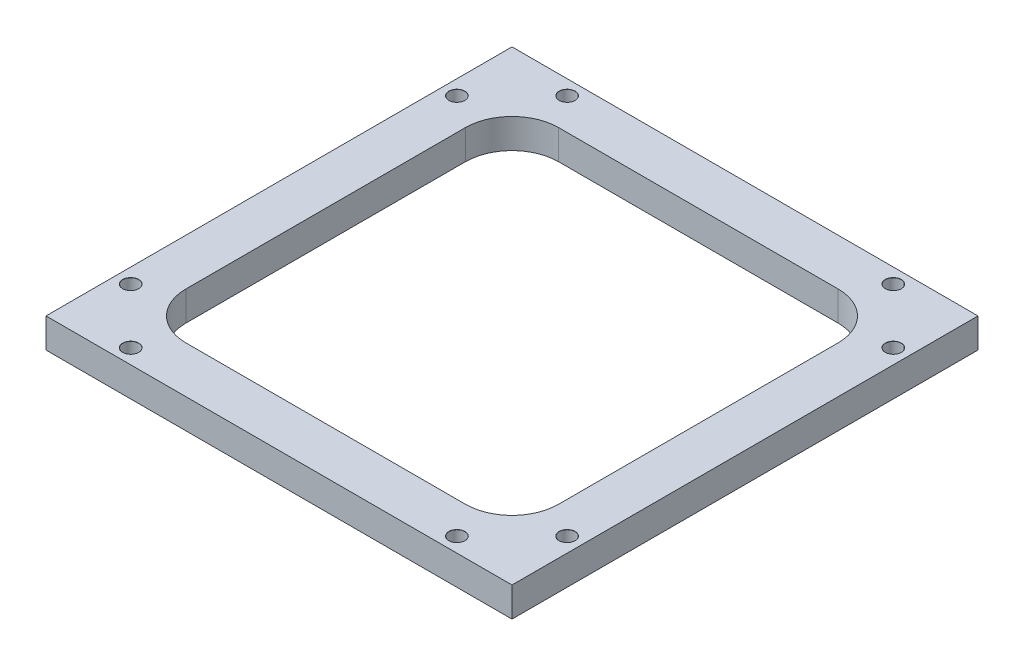
ISO-10303-21;
HEADER;
FILE_DESCRIPTION(('STEP AP214'),'2;1');
FILE_NAME('part.step','',(''),(''),'','','');
FILE_SCHEMA(('AUTOMOTIVE_DESIGN { 1 0 10303 214 1 1 1 1 }'));
ENDSEC;
DATA;
#1=APPLICATION_CONTEXT('core data for automotive mechanical design processes');
#2=APPLICATION_PROTOCOL_DEFINITION('international standard','automotive_design',2000,#1);
#3=PRODUCT_CONTEXT('',#1,'mechanical');
#4=PRODUCT('Part','Part','',(#3));
#5=PRODUCT_RELATED_PRODUCT_CATEGORY('part','',(#4));
#6=PRODUCT_DEFINITION_FORMATION('','',#4);
#7=PRODUCT_DEFINITION_CONTEXT('part definition',#1,'design');
#8=PRODUCT_DEFINITION('design','',#6,#7);
#9=PRODUCT_DEFINITION_SHAPE('','',#8);
#10=(LENGTH_UNIT() NAMED_UNIT(*) SI_UNIT(.MILLI.,.METRE.));
#11=(NAMED_UNIT(*) PLANE_ANGLE_UNIT() SI_UNIT($,.RADIAN.));
#12=(NAMED_UNIT(*) SI_UNIT($,.STERADIAN.) SOLID_ANGLE_UNIT());
#13=UNCERTAINTY_MEASURE_WITH_UNIT(LENGTH_MEASURE(1.E-05),#10,'distance_accuracy_value','');
#14=(GEOMETRIC_REPRESENTATION_CONTEXT(3) GLOBAL_UNCERTAINTY_ASSIGNED_CONTEXT((#13)) GLOBAL_UNIT_ASSIGNED_CONTEXT((#10,
#11,#12)) REPRESENTATION_CONTEXT('',''));
#15=CARTESIAN_POINT('',(0.,0.,0.));
#16=DIRECTION('',(0.,0.,1.));
#17=DIRECTION('',(1.,0.,0.));
#18=AXIS2_PLACEMENT_3D('',#15,#16,#17);
#19=CARTESIAN_POINT('',(0.,6.35,50.));
#20=DIRECTION('',(0.,0.,-1.));
#21=DIRECTION('',(-1.,0.,0.));
#22=AXIS2_PLACEMENT_3D('',#19,#20,#21);
#23=PLANE('',#22);
#24=DIRECTION('',(1.,0.,0.));
#25=VECTOR('',#24,1.);
#26=CARTESIAN_POINT('',(0.,0.,50.));
#27=LINE('',#26,#25);
#28=CARTESIAN_POINT('',(-50.,0.,50.));
#29=VERTEX_POINT('',#28);
#30=CARTESIAN_POINT('',(50.,0.,50.));
#31=VERTEX_POINT('',#30);
#32=EDGE_CURVE('E249',#29,#31,#27,.T.);
#33=ORIENTED_EDGE('',*,*,#32,.T.);
#34=DIRECTION('',(0.,-1.,0.));
#35=VECTOR('',#34,1.);
#36=CARTESIAN_POINT('',(50.,6.35,50.));
#37=LINE('',#36,#35);
#38=CARTESIAN_POINT('',(50.,6.35,50.));
#39=VERTEX_POINT('',#38);
#40=EDGE_CURVE('E278',#39,#31,#37,.T.);
#41=ORIENTED_EDGE('',*,*,#40,.F.);
#42=DIRECTION('',(1.,0.,0.));
#43=VECTOR('',#42,1.);
#44=CARTESIAN_POINT('',(0.,6.35,50.));
#45=LINE('',#44,#43);
#46=CARTESIAN_POINT('',(-50.,6.35,50.));
#47=VERTEX_POINT('',#46);
#48=EDGE_CURVE('E250',#47,#39,#45,.T.);
#49=ORIENTED_EDGE('',*,*,#48,.F.);
#50=DIRECTION('',(0.,-1.,0.));
#51=VECTOR('',#50,1.);
#52=CARTESIAN_POINT('',(-50.,6.35,50.));
#53=LINE('',#52,#51);
#54=EDGE_CURVE('E262',#47,#29,#53,.T.);
#55=ORIENTED_EDGE('',*,*,#54,.T.);
#56=EDGE_LOOP('',(#33,#41,#49,#55));
#57=FACE_BOUND('',#56,.T.);
#58=ADVANCED_FACE('F40',(#57),#23,.F.);
#59=CARTESIAN_POINT('',(50.,6.35,0.));
#60=DIRECTION('',(-1.,0.,0.));
#61=DIRECTION('',(0.,0.,1.));
#62=AXIS2_PLACEMENT_3D('',#59,#60,#61);
#63=PLANE('',#62);
#64=DIRECTION('',(0.,0.,-1.));
#65=VECTOR('',#64,1.);
#66=CARTESIAN_POINT('',(50.,0.,0.));
#67=LINE('',#66,#65);
#68=CARTESIAN_POINT('',(50.,0.,-50.));
#69=VERTEX_POINT('',#68);
#70=EDGE_CURVE('E265',#31,#69,#67,.T.);
#71=ORIENTED_EDGE('',*,*,#70,.T.);
#72=DIRECTION('',(0.,-1.,0.));
#73=VECTOR('',#72,1.);
#74=CARTESIAN_POINT('',(50.,6.35,-50.));
#75=LINE('',#74,#73);
#76=CARTESIAN_POINT('',(50.,6.35,-50.));
#77=VERTEX_POINT('',#76);
#78=EDGE_CURVE('E276',#77,#69,#75,.T.);
#79=ORIENTED_EDGE('',*,*,#78,.F.);
#80=DIRECTION('',(0.,0.,-1.));
#81=VECTOR('',#80,1.);
#82=CARTESIAN_POINT('',(50.,6.35,0.));
#83=LINE('',#82,#81);
#84=EDGE_CURVE('E253',#39,#77,#83,.T.);
#85=ORIENTED_EDGE('',*,*,#84,.F.);
#86=ORIENTED_EDGE('',*,*,#40,.T.);
#87=EDGE_LOOP('',(#71,#79,#85,#86));
#88=FACE_BOUND('',#87,.T.);
#89=ADVANCED_FACE('F331',(#88),#63,.F.);
#90=CARTESIAN_POINT('',(0.,6.35,-50.));
#91=DIRECTION('',(0.,0.,-1.));
#92=DIRECTION('',(-1.,0.,0.));
#93=AXIS2_PLACEMENT_3D('',#90,#91,#92);
#94=PLANE('',#93);
#95=DIRECTION('',(1.,0.,0.));
#96=VECTOR('',#95,1.);
#97=CARTESIAN_POINT('',(0.,0.,-50.));
#98=LINE('',#97,#96);
#99=CARTESIAN_POINT('',(-50.,0.,-50.));
#100=VERTEX_POINT('',#99);
#101=EDGE_CURVE('E268',#100,#69,#98,.T.);
#102=ORIENTED_EDGE('',*,*,#101,.F.);
#103=DIRECTION('',(0.,-1.,0.));
#104=VECTOR('',#103,1.);
#105=CARTESIAN_POINT('',(-50.,6.35,-50.));
#106=LINE('',#105,#104);
#107=CARTESIAN_POINT('',(-50.,6.35,-50.));
#108=VERTEX_POINT('',#107);
#109=EDGE_CURVE('E274',#108,#100,#106,.T.);
#110=ORIENTED_EDGE('',*,*,#109,.F.);
#111=DIRECTION('',(1.,0.,0.));
#112=VECTOR('',#111,1.);
#113=CARTESIAN_POINT('',(0.,6.35,-50.));
#114=LINE('',#113,#112);
#115=EDGE_CURVE('E256',#108,#77,#114,.T.);
#116=ORIENTED_EDGE('',*,*,#115,.T.);
#117=ORIENTED_EDGE('',*,*,#78,.T.);
#118=EDGE_LOOP('',(#102,#110,#116,#117));
#119=FACE_BOUND('',#118,.T.);
#120=ADVANCED_FACE('F336',(#119),#94,.T.);
#121=CARTESIAN_POINT('',(-50.,6.35,0.));
#122=DIRECTION('',(-1.,0.,0.));
#123=DIRECTION('',(0.,0.,1.));
#124=AXIS2_PLACEMENT_3D('',#121,#122,#123);
#125=PLANE('',#124);
#126=DIRECTION('',(0.,0.,-1.));
#127=VECTOR('',#126,1.);
#128=CARTESIAN_POINT('',(-50.,0.,0.));
#129=LINE('',#128,#127);
#130=EDGE_CURVE('E254',#29,#100,#129,.T.);
#131=ORIENTED_EDGE('',*,*,#130,.F.);
#132=ORIENTED_EDGE('',*,*,#54,.F.);
#133=DIRECTION('',(0.,0.,-1.));
#134=VECTOR('',#133,1.);
#135=CARTESIAN_POINT('',(-50.,6.35,0.));
#136=LINE('',#135,#134);
#137=EDGE_CURVE('E259',#47,#108,#136,.T.);
#138=ORIENTED_EDGE('',*,*,#137,.T.);
#139=ORIENTED_EDGE('',*,*,#109,.T.);
#140=EDGE_LOOP('',(#131,#132,#138,#139));
#141=FACE_BOUND('',#140,.T.);
#142=ADVANCED_FACE('F344',(#141),#125,.T.);
#143=CARTESIAN_POINT('',(0.,6.35,0.));
#144=DIRECTION('',(0.,1.,0.));
#145=DIRECTION('',(0.,0.,1.));
#146=AXIS2_PLACEMENT_3D('',#143,#144,#145);
#147=PLANE('',#146);
#148=CARTESIAN_POINT('',(-30.,6.35,30.));
#149=DIRECTION('',(0.,1.,0.));
#150=DIRECTION('',(0.,0.,-1.));
#151=AXIS2_PLACEMENT_3D('',#148,#149,#150);
#152=CIRCLE('',#151,10.);
#153=CARTESIAN_POINT('',(-40.,6.35,29.9999999999999));
#154=VERTEX_POINT('',#153);
#155=CARTESIAN_POINT('',(-29.9999999999999,6.35,40.));
#156=VERTEX_POINT('',#155);
#157=EDGE_CURVE('E54',#154,#156,#152,.T.);
#158=ORIENTED_EDGE('',*,*,#157,.F.);
#159=DIRECTION('',(0.,0.,1.));
#160=VECTOR('',#159,1.);
#161=CARTESIAN_POINT('',(-40.,6.35,29.9999999999999));
#162=LINE('',#161,#160);
#163=CARTESIAN_POINT('',(-40.,6.35,-29.9999999999999));
#164=VERTEX_POINT('',#163);
#165=EDGE_CURVE('E162',#164,#154,#162,.T.);
#166=ORIENTED_EDGE('',*,*,#165,.F.);
#167=CARTESIAN_POINT('',(-30.,6.35,-30.));
#168=DIRECTION('',(0.,1.,0.));
#169=DIRECTION('',(0.,0.,1.));
#170=AXIS2_PLACEMENT_3D('',#167,#168,#169);
#171=CIRCLE('',#170,10.);
#172=CARTESIAN_POINT('',(-29.9999999999999,6.35,-40.));
#173=VERTEX_POINT('',#172);
#174=EDGE_CURVE('E159',#173,#164,#171,.T.);
#175=ORIENTED_EDGE('',*,*,#174,.F.);
#176=DIRECTION('',(-1.,0.,0.));
#177=VECTOR('',#176,1.);
#178=CARTESIAN_POINT('',(-29.9999999999999,6.35,-40.));
#179=LINE('',#178,#177);
#180=CARTESIAN_POINT('',(29.9999999999999,6.35,-40.));
#181=VERTEX_POINT('',#180);
#182=EDGE_CURVE('E156',#181,#173,#179,.T.);
#183=ORIENTED_EDGE('',*,*,#182,.F.);
#184=CARTESIAN_POINT('',(30.,6.35,-30.));
#185=DIRECTION('',(0.,1.,0.));
#186=DIRECTION('',(0.,0.,-1.));
#187=AXIS2_PLACEMENT_3D('',#184,#185,#186);
#188=CIRCLE('',#187,10.);
#189=CARTESIAN_POINT('',(40.,6.35,-29.9999999999999));
#190=VERTEX_POINT('',#189);
#191=EDGE_CURVE('E150',#190,#181,#188,.T.);
#192=ORIENTED_EDGE('',*,*,#191,.F.);
#193=DIRECTION('',(0.,0.,-1.));
#194=VECTOR('',#193,1.);
#195=CARTESIAN_POINT('',(40.,6.35,29.9999999999999));
#196=LINE('',#195,#194);
#197=CARTESIAN_POINT('',(40.,6.35,29.9999999999999));
#198=VERTEX_POINT('',#197);
#199=EDGE_CURVE('E148',#198,#190,#196,.T.);
#200=ORIENTED_EDGE('',*,*,#199,.F.);
#201=CARTESIAN_POINT('',(30.,6.35,30.));
#202=DIRECTION('',(0.,1.,0.));
#203=DIRECTION('',(0.,0.,-1.));
#204=AXIS2_PLACEMENT_3D('',#201,#202,#203);
#205=CIRCLE('',#204,10.);
#206=CARTESIAN_POINT('',(29.9999999999999,6.35,40.));
#207=VERTEX_POINT('',#206);
#208=EDGE_CURVE('E131',#207,#198,#205,.T.);
#209=ORIENTED_EDGE('',*,*,#208,.F.);
#210=DIRECTION('',(1.,0.,0.));
#211=VECTOR('',#210,1.);
#212=CARTESIAN_POINT('',(-29.9999999999999,6.35,40.));
#213=LINE('',#212,#211);
#214=EDGE_CURVE('E140',#156,#207,#213,.T.);
#215=ORIENTED_EDGE('',*,*,#214,.F.);
#216=EDGE_LOOP('',(#158,#166,#175,#183,#192,#200,#209,#215));
#217=FACE_BOUND('',#216,.T.);
#218=CARTESIAN_POINT('',(-46.825,6.35,-35.));
#219=DIRECTION('',(0.,1.,0.));
#220=DIRECTION('',(0.,0.,1.));
#221=AXIS2_PLACEMENT_3D('',#218,#219,#220);
#222=CIRCLE('',#221,1.725);
#223=CARTESIAN_POINT('',(-46.825,6.35,-33.275));
#224=VERTEX_POINT('',#223);
#225=EDGE_CURVE('E167',#224,#224,#222,.T.);
#226=ORIENTED_EDGE('',*,*,#225,.F.);
#227=EDGE_LOOP('',(#226));
#228=FACE_BOUND('',#227,.T.);
#229=CARTESIAN_POINT('',(-35.,6.35,-46.825));
#230=DIRECTION('',(0.,1.,0.));
#231=DIRECTION('',(0.,0.,1.));
#232=AXIS2_PLACEMENT_3D('',#229,#230,#231);
#233=CIRCLE('',#232,1.725);
#234=CARTESIAN_POINT('',(-35.,6.35,-45.1));
#235=VERTEX_POINT('',#234);
#236=EDGE_CURVE('E186',#235,#235,#233,.T.);
#237=ORIENTED_EDGE('',*,*,#236,.F.);
#238=EDGE_LOOP('',(#237));
#239=FACE_BOUND('',#238,.T.);
#240=CARTESIAN_POINT('',(35.,6.35,-46.825));
#241=DIRECTION('',(0.,1.,0.));
#242=DIRECTION('',(0.,0.,1.));
#243=AXIS2_PLACEMENT_3D('',#240,#241,#242);
#244=CIRCLE('',#243,1.725);
#245=CARTESIAN_POINT('',(35.,6.35,-45.1));
#246=VERTEX_POINT('',#245);
#247=EDGE_CURVE('E195',#246,#246,#244,.T.);
#248=ORIENTED_EDGE('',*,*,#247,.F.);
#249=EDGE_LOOP('',(#248));
#250=FACE_BOUND('',#249,.T.);
#251=CARTESIAN_POINT('',(46.825,6.35,-35.));
#252=DIRECTION('',(0.,1.,0.));
#253=DIRECTION('',(0.,0.,1.));
#254=AXIS2_PLACEMENT_3D('',#251,#252,#253);
#255=CIRCLE('',#254,1.725);
#256=CARTESIAN_POINT('',(46.825,6.35,-33.275));
#257=VERTEX_POINT('',#256);
#258=EDGE_CURVE('E204',#257,#257,#255,.T.);
#259=ORIENTED_EDGE('',*,*,#258,.F.);
#260=EDGE_LOOP('',(#259));
#261=FACE_BOUND('',#260,.T.);
#262=CARTESIAN_POINT('',(46.825,6.35,35.));
#263=DIRECTION('',(0.,1.,0.));
#264=DIRECTION('',(0.,0.,1.));
#265=AXIS2_PLACEMENT_3D('',#262,#263,#264);
#266=CIRCLE('',#265,1.725);
#267=CARTESIAN_POINT('',(46.825,6.35,36.725));
#268=VERTEX_POINT('',#267);
#269=EDGE_CURVE('E213',#268,#268,#266,.T.);
#270=ORIENTED_EDGE('',*,*,#269,.F.);
#271=EDGE_LOOP('',(#270));
#272=FACE_BOUND('',#271,.T.);
#273=CARTESIAN_POINT('',(35.,6.35,46.825));
#274=DIRECTION('',(0.,1.,0.));
#275=DIRECTION('',(0.,0.,1.));
#276=AXIS2_PLACEMENT_3D('',#273,#274,#275);
#277=CIRCLE('',#276,1.725);
#278=CARTESIAN_POINT('',(35.,6.35,48.55));
#279=VERTEX_POINT('',#278);
#280=EDGE_CURVE('E222',#279,#279,#277,.T.);
#281=ORIENTED_EDGE('',*,*,#280,.F.);
#282=EDGE_LOOP('',(#281));
#283=FACE_BOUND('',#282,.T.);
#284=CARTESIAN_POINT('',(-35.,6.35,46.825));
#285=DIRECTION('',(0.,1.,0.));
#286=DIRECTION('',(0.,0.,1.));
#287=AXIS2_PLACEMENT_3D('',#284,#285,#286);
#288=CIRCLE('',#287,1.725);
#289=CARTESIAN_POINT('',(-35.,6.35,48.55));
#290=VERTEX_POINT('',#289);
#291=EDGE_CURVE('E231',#290,#290,#288,.T.);
#292=ORIENTED_EDGE('',*,*,#291,.F.);
#293=EDGE_LOOP('',(#292));
#294=FACE_BOUND('',#293,.T.);
#295=CARTESIAN_POINT('',(-46.825,6.35,35.));
#296=DIRECTION('',(0.,1.,0.));
#297=DIRECTION('',(0.,0.,1.));
#298=AXIS2_PLACEMENT_3D('',#295,#296,#297);
#299=CIRCLE('',#298,1.725);
#300=CARTESIAN_POINT('',(-46.825,6.35,36.725));
#301=VERTEX_POINT('',#300);
#302=EDGE_CURVE('E240',#301,#301,#299,.T.);
#303=ORIENTED_EDGE('',*,*,#302,.F.);
#304=EDGE_LOOP('',(#303));
#305=FACE_BOUND('',#304,.T.);
#306=ORIENTED_EDGE('',*,*,#48,.T.);
#307=ORIENTED_EDGE('',*,*,#84,.T.);
#308=ORIENTED_EDGE('',*,*,#115,.F.);
#309=ORIENTED_EDGE('',*,*,#137,.F.);
#310=EDGE_LOOP('',(#306,#307,#308,#309));
#311=FACE_BOUND('',#310,.T.);
#312=ADVANCED_FACE('F144',(#217,#228,#239,#250,#261,#272,#283,#294,#305,#311),#147,.T.);
#313=CARTESIAN_POINT('',(0.,0.,0.));
#314=DIRECTION('',(0.,1.,0.));
#315=DIRECTION('',(0.,0.,1.));
#316=AXIS2_PLACEMENT_3D('',#313,#314,#315);
#317=PLANE('',#316);
#318=DIRECTION('',(0.,0.,1.));
#319=VECTOR('',#318,1.);
#320=CARTESIAN_POINT('',(-40.,0.,0.));
#321=LINE('',#320,#319);
#322=CARTESIAN_POINT('',(-40.,0.,-29.9999999999999));
#323=VERTEX_POINT('',#322);
#324=CARTESIAN_POINT('',(-40.,0.,29.9999999999999));
#325=VERTEX_POINT('',#324);
#326=EDGE_CURVE('E47',#323,#325,#321,.T.);
#327=ORIENTED_EDGE('',*,*,#326,.T.);
#328=CARTESIAN_POINT('',(-30.,0.,30.));
#329=DIRECTION('',(0.,1.,0.));
#330=DIRECTION('',(0.,0.,1.));
#331=AXIS2_PLACEMENT_3D('',#328,#329,#330);
#332=CIRCLE('',#331,10.);
#333=CARTESIAN_POINT('',(-29.9999999999999,0.,40.));
#334=VERTEX_POINT('',#333);
#335=EDGE_CURVE('E11',#325,#334,#332,.T.);
#336=ORIENTED_EDGE('',*,*,#335,.T.);
#337=DIRECTION('',(1.,0.,0.));
#338=VECTOR('',#337,1.);
#339=CARTESIAN_POINT('',(0.,0.,40.));
#340=LINE('',#339,#338);
#341=CARTESIAN_POINT('',(29.9999999999999,0.,40.));
#342=VERTEX_POINT('',#341);
#343=EDGE_CURVE('E281',#334,#342,#340,.T.);
#344=ORIENTED_EDGE('',*,*,#343,.T.);
#345=CARTESIAN_POINT('',(30.,0.,30.));
#346=DIRECTION('',(0.,1.,0.));
#347=DIRECTION('',(0.,0.,1.));
#348=AXIS2_PLACEMENT_3D('',#345,#346,#347);
#349=CIRCLE('',#348,10.);
#350=CARTESIAN_POINT('',(40.,0.,29.9999999999999));
#351=VERTEX_POINT('',#350);
#352=EDGE_CURVE('E134',#342,#351,#349,.T.);
#353=ORIENTED_EDGE('',*,*,#352,.T.);
#354=DIRECTION('',(0.,0.,-1.));
#355=VECTOR('',#354,1.);
#356=CARTESIAN_POINT('',(40.,0.,0.));
#357=LINE('',#356,#355);
#358=CARTESIAN_POINT('',(40.,0.,-29.9999999999999));
#359=VERTEX_POINT('',#358);
#360=EDGE_CURVE('E284',#351,#359,#357,.T.);
#361=ORIENTED_EDGE('',*,*,#360,.T.);
#362=CARTESIAN_POINT('',(30.,0.,-30.));
#363=DIRECTION('',(0.,1.,0.));
#364=DIRECTION('',(0.,0.,1.));
#365=AXIS2_PLACEMENT_3D('',#362,#363,#364);
#366=CIRCLE('',#365,10.);
#367=CARTESIAN_POINT('',(29.9999999999999,0.,-40.));
#368=VERTEX_POINT('',#367);
#369=EDGE_CURVE('E287',#359,#368,#366,.T.);
#370=ORIENTED_EDGE('',*,*,#369,.T.);
#371=DIRECTION('',(-1.,0.,0.));
#372=VECTOR('',#371,1.);
#373=CARTESIAN_POINT('',(0.,0.,-40.));
#374=LINE('',#373,#372);
#375=CARTESIAN_POINT('',(-29.9999999999999,0.,-40.));
#376=VERTEX_POINT('',#375);
#377=EDGE_CURVE('E290',#368,#376,#374,.T.);
#378=ORIENTED_EDGE('',*,*,#377,.T.);
#379=CARTESIAN_POINT('',(-30.,0.,-30.));
#380=DIRECTION('',(0.,1.,0.));
#381=DIRECTION('',(0.,0.,1.));
#382=AXIS2_PLACEMENT_3D('',#379,#380,#381);
#383=CIRCLE('',#382,10.);
#384=EDGE_CURVE('E293',#376,#323,#383,.T.);
#385=ORIENTED_EDGE('',*,*,#384,.T.);
#386=EDGE_LOOP('',(#327,#336,#344,#353,#361,#370,#378,#385));
#387=FACE_BOUND('',#386,.T.);
#388=CARTESIAN_POINT('',(-46.825,0.,-35.));
#389=DIRECTION('',(0.,1.,0.));
#390=DIRECTION('',(0.,0.,1.));
#391=AXIS2_PLACEMENT_3D('',#388,#389,#390);
#392=CIRCLE('',#391,1.7);
#393=CARTESIAN_POINT('',(-46.825,0.,-33.3));
#394=VERTEX_POINT('',#393);
#395=EDGE_CURVE('E183',#394,#394,#392,.T.);
#396=ORIENTED_EDGE('',*,*,#395,.T.);
#397=EDGE_LOOP('',(#396));
#398=FACE_BOUND('',#397,.T.);
#399=CARTESIAN_POINT('',(-35.,0.,-46.825));
#400=DIRECTION('',(0.,1.,0.));
#401=DIRECTION('',(0.,0.,1.));
#402=AXIS2_PLACEMENT_3D('',#399,#400,#401);
#403=CIRCLE('',#402,1.7);
#404=CARTESIAN_POINT('',(-35.,0.,-45.125));
#405=VERTEX_POINT('',#404);
#406=EDGE_CURVE('E192',#405,#405,#403,.T.);
#407=ORIENTED_EDGE('',*,*,#406,.T.);
#408=EDGE_LOOP('',(#407));
#409=FACE_BOUND('',#408,.T.);
#410=CARTESIAN_POINT('',(35.,0.,-46.825));
#411=DIRECTION('',(0.,1.,0.));
#412=DIRECTION('',(0.,0.,1.));
#413=AXIS2_PLACEMENT_3D('',#410,#411,#412);
#414=CIRCLE('',#413,1.7);
#415=CARTESIAN_POINT('',(35.,0.,-45.125));
#416=VERTEX_POINT('',#415);
#417=EDGE_CURVE('E201',#416,#416,#414,.T.);
#418=ORIENTED_EDGE('',*,*,#417,.T.);
#419=EDGE_LOOP('',(#418));
#420=FACE_BOUND('',#419,.T.);
#421=CARTESIAN_POINT('',(46.825,0.,-35.));
#422=DIRECTION('',(0.,1.,0.));
#423=DIRECTION('',(0.,0.,1.));
#424=AXIS2_PLACEMENT_3D('',#421,#422,#423);
#425=CIRCLE('',#424,1.7);
#426=CARTESIAN_POINT('',(46.825,0.,-33.3));
#427=VERTEX_POINT('',#426);
#428=EDGE_CURVE('E210',#427,#427,#425,.T.);
#429=ORIENTED_EDGE('',*,*,#428,.T.);
#430=EDGE_LOOP('',(#429));
#431=FACE_BOUND('',#430,.T.);
#432=CARTESIAN_POINT('',(46.825,0.,35.));
#433=DIRECTION('',(0.,1.,0.));
#434=DIRECTION('',(0.,0.,1.));
#435=AXIS2_PLACEMENT_3D('',#432,#433,#434);
#436=CIRCLE('',#435,1.7);
#437=CARTESIAN_POINT('',(46.825,0.,36.7));
#438=VERTEX_POINT('',#437);
#439=EDGE_CURVE('E219',#438,#438,#436,.T.);
#440=ORIENTED_EDGE('',*,*,#439,.T.);
#441=EDGE_LOOP('',(#440));
#442=FACE_BOUND('',#441,.T.);
#443=CARTESIAN_POINT('',(35.,0.,46.825));
#444=DIRECTION('',(0.,1.,0.));
#445=DIRECTION('',(0.,0.,1.));
#446=AXIS2_PLACEMENT_3D('',#443,#444,#445);
#447=CIRCLE('',#446,1.7);
#448=CARTESIAN_POINT('',(35.,0.,48.525));
#449=VERTEX_POINT('',#448);
#450=EDGE_CURVE('E228',#449,#449,#447,.T.);
#451=ORIENTED_EDGE('',*,*,#450,.T.);
#452=EDGE_LOOP('',(#451));
#453=FACE_BOUND('',#452,.T.);
#454=CARTESIAN_POINT('',(-35.,0.,46.825));
#455=DIRECTION('',(0.,1.,0.));
#456=DIRECTION('',(0.,0.,1.));
#457=AXIS2_PLACEMENT_3D('',#454,#455,#456);
#458=CIRCLE('',#457,1.7);
#459=CARTESIAN_POINT('',(-35.,0.,48.525));
#460=VERTEX_POINT('',#459);
#461=EDGE_CURVE('E237',#460,#460,#458,.T.);
#462=ORIENTED_EDGE('',*,*,#461,.T.);
#463=EDGE_LOOP('',(#462));
#464=FACE_BOUND('',#463,.T.);
#465=CARTESIAN_POINT('',(-46.825,0.,35.));
#466=DIRECTION('',(0.,1.,0.));
#467=DIRECTION('',(0.,0.,1.));
#468=AXIS2_PLACEMENT_3D('',#465,#466,#467);
#469=CIRCLE('',#468,1.7);
#470=CARTESIAN_POINT('',(-46.825,0.,36.7));
#471=VERTEX_POINT('',#470);
#472=EDGE_CURVE('E246',#471,#471,#469,.T.);
#473=ORIENTED_EDGE('',*,*,#472,.T.);
#474=EDGE_LOOP('',(#473));
#475=FACE_BOUND('',#474,.T.);
#476=ORIENTED_EDGE('',*,*,#32,.F.);
#477=ORIENTED_EDGE('',*,*,#130,.T.);
#478=ORIENTED_EDGE('',*,*,#101,.T.);
#479=ORIENTED_EDGE('',*,*,#70,.F.);
#480=EDGE_LOOP('',(#476,#477,#478,#479));
#481=FACE_BOUND('',#480,.T.);
#482=ADVANCED_FACE('F297',(#387,#398,#409,#420,#431,#442,#453,#464,#475,#481),#317,.F.);
#483=CARTESIAN_POINT('',(-46.825,6.35,35.));
#484=DIRECTION('',(0.,1.,0.));
#485=DIRECTION('',(0.,0.,1.));
#486=AXIS2_PLACEMENT_3D('',#483,#484,#485);
#487=CYLINDRICAL_SURFACE('',#486,1.7);
#488=ORIENTED_EDGE('',*,*,#472,.F.);
#489=EDGE_LOOP('',(#488));
#490=FACE_BOUND('',#489,.T.);
#491=CARTESIAN_POINT('',(-46.825,6.325,35.));
#492=DIRECTION('',(0.,1.,0.));
#493=DIRECTION('',(0.,0.,1.));
#494=AXIS2_PLACEMENT_3D('',#491,#492,#493);
#495=CIRCLE('',#494,1.7);
#496=CARTESIAN_POINT('',(-46.825,6.325,36.7));
#497=VERTEX_POINT('',#496);
#498=EDGE_CURVE('E243',#497,#497,#495,.T.);
#499=ORIENTED_EDGE('',*,*,#498,.T.);
#500=EDGE_LOOP('',(#499));
#501=FACE_BOUND('',#500,.T.);
#502=ADVANCED_FACE('F357',(#490,#501),#487,.F.);
#503=CARTESIAN_POINT('',(-46.825,6.35,35.));
#504=DIRECTION('',(0.,1.,0.));
#505=DIRECTION('',(0.,0.,1.));
#506=AXIS2_PLACEMENT_3D('',#503,#504,#505);
#507=CONICAL_SURFACE('',#506,1.725,0.785398163397362);
#508=ORIENTED_EDGE('',*,*,#498,.F.);
#509=EDGE_LOOP('',(#508));
#510=FACE_BOUND('',#509,.T.);
#511=ORIENTED_EDGE('',*,*,#302,.T.);
#512=EDGE_LOOP('',(#511));
#513=FACE_BOUND('',#512,.T.);
#514=ADVANCED_FACE('F382',(#510,#513),#507,.F.);
#515=CARTESIAN_POINT('',(-35.,6.35,46.825));
#516=DIRECTION('',(0.,1.,0.));
#517=DIRECTION('',(0.,0.,1.));
#518=AXIS2_PLACEMENT_3D('',#515,#516,#517);
#519=CYLINDRICAL_SURFACE('',#518,1.7);
#520=ORIENTED_EDGE('',*,*,#461,.F.);
#521=EDGE_LOOP('',(#520));
#522=FACE_BOUND('',#521,.T.);
#523=CARTESIAN_POINT('',(-35.,6.325,46.825));
#524=DIRECTION('',(0.,1.,0.));
#525=DIRECTION('',(0.,0.,1.));
#526=AXIS2_PLACEMENT_3D('',#523,#524,#525);
#527=CIRCLE('',#526,1.7);
#528=CARTESIAN_POINT('',(-35.,6.325,48.525));
#529=VERTEX_POINT('',#528);
#530=EDGE_CURVE('E234',#529,#529,#527,.T.);
#531=ORIENTED_EDGE('',*,*,#530,.T.);
#532=EDGE_LOOP('',(#531));
#533=FACE_BOUND('',#532,.T.);
#534=ADVANCED_FACE('F392',(#522,#533),#519,.F.);
#535=CARTESIAN_POINT('',(-35.,6.35,46.825));
#536=DIRECTION('',(0.,1.,0.));
#537=DIRECTION('',(0.,0.,1.));
#538=AXIS2_PLACEMENT_3D('',#535,#536,#537);
#539=CONICAL_SURFACE('',#538,1.725,0.785398163397362);
#540=ORIENTED_EDGE('',*,*,#530,.F.);
#541=EDGE_LOOP('',(#540));
#542=FACE_BOUND('',#541,.T.);
#543=ORIENTED_EDGE('',*,*,#291,.T.);
#544=EDGE_LOOP('',(#543));
#545=FACE_BOUND('',#544,.T.);
#546=ADVANCED_FACE('F401',(#542,#545),#539,.F.);
#547=CARTESIAN_POINT('',(35.,6.35,46.825));
#548=DIRECTION('',(0.,1.,0.));
#549=DIRECTION('',(0.,0.,1.));
#550=AXIS2_PLACEMENT_3D('',#547,#548,#549);
#551=CYLINDRICAL_SURFACE('',#550,1.7);
#552=ORIENTED_EDGE('',*,*,#450,.F.);
#553=EDGE_LOOP('',(#552));
#554=FACE_BOUND('',#553,.T.);
#555=CARTESIAN_POINT('',(35.,6.325,46.825));
#556=DIRECTION('',(0.,1.,0.));
#557=DIRECTION('',(0.,0.,1.));
#558=AXIS2_PLACEMENT_3D('',#555,#556,#557);
#559=CIRCLE('',#558,1.7);
#560=CARTESIAN_POINT('',(35.,6.325,48.525));
#561=VERTEX_POINT('',#560);
#562=EDGE_CURVE('E225',#561,#561,#559,.T.);
#563=ORIENTED_EDGE('',*,*,#562,.T.);
#564=EDGE_LOOP('',(#563));
#565=FACE_BOUND('',#564,.T.);
#566=ADVANCED_FACE('F411',(#554,#565),#551,.F.);
#567=CARTESIAN_POINT('',(35.,6.35,46.825));
#568=DIRECTION('',(0.,1.,0.));
#569=DIRECTION('',(0.,0.,1.));
#570=AXIS2_PLACEMENT_3D('',#567,#568,#569);
#571=CONICAL_SURFACE('',#570,1.725,0.785398163397362);
#572=ORIENTED_EDGE('',*,*,#562,.F.);
#573=EDGE_LOOP('',(#572));
#574=FACE_BOUND('',#573,.T.);
#575=ORIENTED_EDGE('',*,*,#280,.T.);
#576=EDGE_LOOP('',(#575));
#577=FACE_BOUND('',#576,.T.);
#578=ADVANCED_FACE('F421',(#574,#577),#571,.F.);
#579=CARTESIAN_POINT('',(46.825,6.35,35.));
#580=DIRECTION('',(0.,1.,0.));
#581=DIRECTION('',(0.,0.,1.));
#582=AXIS2_PLACEMENT_3D('',#579,#580,#581);
#583=CYLINDRICAL_SURFACE('',#582,1.7);
#584=ORIENTED_EDGE('',*,*,#439,.F.);
#585=EDGE_LOOP('',(#584));
#586=FACE_BOUND('',#585,.T.);
#587=CARTESIAN_POINT('',(46.825,6.325,35.));
#588=DIRECTION('',(0.,1.,0.));
#589=DIRECTION('',(0.,0.,1.));
#590=AXIS2_PLACEMENT_3D('',#587,#588,#589);
#591=CIRCLE('',#590,1.7);
#592=CARTESIAN_POINT('',(46.825,6.325,36.7));
#593=VERTEX_POINT('',#592);
#594=EDGE_CURVE('E216',#593,#593,#591,.T.);
#595=ORIENTED_EDGE('',*,*,#594,.T.);
#596=EDGE_LOOP('',(#595));
#597=FACE_BOUND('',#596,.T.);
#598=ADVANCED_FACE('F431',(#586,#597),#583,.F.);
#599=CARTESIAN_POINT('',(46.825,6.35,35.));
#600=DIRECTION('',(0.,1.,0.));
#601=DIRECTION('',(0.,0.,1.));
#602=AXIS2_PLACEMENT_3D('',#599,#600,#601);
#603=CONICAL_SURFACE('',#602,1.725,0.785398163397362);
#604=ORIENTED_EDGE('',*,*,#594,.F.);
#605=EDGE_LOOP('',(#604));
#606=FACE_BOUND('',#605,.T.);
#607=ORIENTED_EDGE('',*,*,#269,.T.);
#608=EDGE_LOOP('',(#607));
#609=FACE_BOUND('',#608,.T.);
#610=ADVANCED_FACE('F441',(#606,#609),#603,.F.);
#611=CARTESIAN_POINT('',(46.825,6.35,-35.));
#612=DIRECTION('',(0.,1.,0.));
#613=DIRECTION('',(0.,0.,1.));
#614=AXIS2_PLACEMENT_3D('',#611,#612,#613);
#615=CYLINDRICAL_SURFACE('',#614,1.7);
#616=ORIENTED_EDGE('',*,*,#428,.F.);
#617=EDGE_LOOP('',(#616));
#618=FACE_BOUND('',#617,.T.);
#619=CARTESIAN_POINT('',(46.825,6.325,-35.));
#620=DIRECTION('',(0.,1.,0.));
#621=DIRECTION('',(0.,0.,1.));
#622=AXIS2_PLACEMENT_3D('',#619,#620,#621);
#623=CIRCLE('',#622,1.7);
#624=CARTESIAN_POINT('',(46.825,6.325,-33.3));
#625=VERTEX_POINT('',#624);
#626=EDGE_CURVE('E207',#625,#625,#623,.T.);
#627=ORIENTED_EDGE('',*,*,#626,.T.);
#628=EDGE_LOOP('',(#627));
#629=FACE_BOUND('',#628,.T.);
#630=ADVANCED_FACE('F451',(#618,#629),#615,.F.);
#631=CARTESIAN_POINT('',(46.825,6.35,-35.));
#632=DIRECTION('',(0.,1.,0.));
#633=DIRECTION('',(0.,0.,1.));
#634=AXIS2_PLACEMENT_3D('',#631,#632,#633);
#635=CONICAL_SURFACE('',#634,1.725,0.785398163397362);
#636=ORIENTED_EDGE('',*,*,#626,.F.);
#637=EDGE_LOOP('',(#636));
#638=FACE_BOUND('',#637,.T.);
#639=ORIENTED_EDGE('',*,*,#258,.T.);
#640=EDGE_LOOP('',(#639));
#641=FACE_BOUND('',#640,.T.);
#642=ADVANCED_FACE('F461',(#638,#641),#635,.F.);
#643=CARTESIAN_POINT('',(35.,6.35,-46.825));
#644=DIRECTION('',(0.,1.,0.));
#645=DIRECTION('',(0.,0.,1.));
#646=AXIS2_PLACEMENT_3D('',#643,#644,#645);
#647=CYLINDRICAL_SURFACE('',#646,1.7);
#648=ORIENTED_EDGE('',*,*,#417,.F.);
#649=EDGE_LOOP('',(#648));
#650=FACE_BOUND('',#649,.T.);
#651=CARTESIAN_POINT('',(35.,6.325,-46.825));
#652=DIRECTION('',(0.,1.,0.));
#653=DIRECTION('',(0.,0.,1.));
#654=AXIS2_PLACEMENT_3D('',#651,#652,#653);
#655=CIRCLE('',#654,1.7);
#656=CARTESIAN_POINT('',(35.,6.325,-45.125));
#657=VERTEX_POINT('',#656);
#658=EDGE_CURVE('E198',#657,#657,#655,.T.);
#659=ORIENTED_EDGE('',*,*,#658,.T.);
#660=EDGE_LOOP('',(#659));
#661=FACE_BOUND('',#660,.T.);
#662=ADVANCED_FACE('F471',(#650,#661),#647,.F.);
#663=CARTESIAN_POINT('',(35.,6.35,-46.825));
#664=DIRECTION('',(0.,1.,0.));
#665=DIRECTION('',(0.,0.,1.));
#666=AXIS2_PLACEMENT_3D('',#663,#664,#665);
#667=CONICAL_SURFACE('',#666,1.725,0.785398163397362);
#668=ORIENTED_EDGE('',*,*,#658,.F.);
#669=EDGE_LOOP('',(#668));
#670=FACE_BOUND('',#669,.T.);
#671=ORIENTED_EDGE('',*,*,#247,.T.);
#672=EDGE_LOOP('',(#671));
#673=FACE_BOUND('',#672,.T.);
#674=ADVANCED_FACE('F481',(#670,#673),#667,.F.);
#675=CARTESIAN_POINT('',(-35.,6.35,-46.825));
#676=DIRECTION('',(0.,1.,0.));
#677=DIRECTION('',(0.,0.,1.));
#678=AXIS2_PLACEMENT_3D('',#675,#676,#677);
#679=CYLINDRICAL_SURFACE('',#678,1.7);
#680=ORIENTED_EDGE('',*,*,#406,.F.);
#681=EDGE_LOOP('',(#680));
#682=FACE_BOUND('',#681,.T.);
#683=CARTESIAN_POINT('',(-35.,6.325,-46.825));
#684=DIRECTION('',(0.,1.,0.));
#685=DIRECTION('',(0.,0.,1.));
#686=AXIS2_PLACEMENT_3D('',#683,#684,#685);
#687=CIRCLE('',#686,1.7);
#688=CARTESIAN_POINT('',(-35.,6.325,-45.125));
#689=VERTEX_POINT('',#688);
#690=EDGE_CURVE('E189',#689,#689,#687,.T.);
#691=ORIENTED_EDGE('',*,*,#690,.T.);
#692=EDGE_LOOP('',(#691));
#693=FACE_BOUND('',#692,.T.);
#694=ADVANCED_FACE('F491',(#682,#693),#679,.F.);
#695=CARTESIAN_POINT('',(-35.,6.35,-46.825));
#696=DIRECTION('',(0.,1.,0.));
#697=DIRECTION('',(0.,0.,1.));
#698=AXIS2_PLACEMENT_3D('',#695,#696,#697);
#699=CONICAL_SURFACE('',#698,1.725,0.785398163397362);
#700=ORIENTED_EDGE('',*,*,#690,.F.);
#701=EDGE_LOOP('',(#700));
#702=FACE_BOUND('',#701,.T.);
#703=ORIENTED_EDGE('',*,*,#236,.T.);
#704=EDGE_LOOP('',(#703));
#705=FACE_BOUND('',#704,.T.);
#706=ADVANCED_FACE('F501',(#702,#705),#699,.F.);
#707=CARTESIAN_POINT('',(-46.825,6.35,-35.));
#708=DIRECTION('',(0.,1.,0.));
#709=DIRECTION('',(0.,0.,1.));
#710=AXIS2_PLACEMENT_3D('',#707,#708,#709);
#711=CYLINDRICAL_SURFACE('',#710,1.7);
#712=ORIENTED_EDGE('',*,*,#395,.F.);
#713=EDGE_LOOP('',(#712));
#714=FACE_BOUND('',#713,.T.);
#715=CARTESIAN_POINT('',(-46.825,6.325,-35.));
#716=DIRECTION('',(0.,1.,0.));
#717=DIRECTION('',(0.,0.,1.));
#718=AXIS2_PLACEMENT_3D('',#715,#716,#717);
#719=CIRCLE('',#718,1.7);
#720=CARTESIAN_POINT('',(-46.825,6.325,-33.3));
#721=VERTEX_POINT('',#720);
#722=EDGE_CURVE('E180',#721,#721,#719,.T.);
#723=ORIENTED_EDGE('',*,*,#722,.T.);
#724=EDGE_LOOP('',(#723));
#725=FACE_BOUND('',#724,.T.);
#726=ADVANCED_FACE('F326',(#714,#725),#711,.F.);
#727=CARTESIAN_POINT('',(-46.825,6.35,-35.));
#728=DIRECTION('',(0.,1.,0.));
#729=DIRECTION('',(0.,0.,1.));
#730=AXIS2_PLACEMENT_3D('',#727,#728,#729);
#731=CONICAL_SURFACE('',#730,1.725,0.785398163397362);
#732=ORIENTED_EDGE('',*,*,#722,.F.);
#733=EDGE_LOOP('',(#732));
#734=FACE_BOUND('',#733,.T.);
#735=ORIENTED_EDGE('',*,*,#225,.T.);
#736=EDGE_LOOP('',(#735));
#737=FACE_BOUND('',#736,.T.);
#738=ADVANCED_FACE('F319',(#734,#737),#731,.F.);
#739=CARTESIAN_POINT('',(-30.,-3.65,30.));
#740=DIRECTION('',(0.,1.,0.));
#741=DIRECTION('',(0.,0.,1.));
#742=AXIS2_PLACEMENT_3D('',#739,#740,#741);
#743=CYLINDRICAL_SURFACE('',#742,10.);
#744=DIRECTION('',(0.,1.,0.));
#745=VECTOR('',#744,1.);
#746=CARTESIAN_POINT('',(-40.,-3.65,29.9999999999999));
#747=LINE('',#746,#745);
#748=EDGE_CURVE('E165',#325,#154,#747,.T.);
#749=ORIENTED_EDGE('',*,*,#748,.T.);
#750=ORIENTED_EDGE('',*,*,#157,.T.);
#751=DIRECTION('',(0.,1.,0.));
#752=VECTOR('',#751,1.);
#753=CARTESIAN_POINT('',(-29.9999999999999,-3.65,40.));
#754=LINE('',#753,#752);
#755=EDGE_CURVE('E137',#334,#156,#754,.T.);
#756=ORIENTED_EDGE('',*,*,#755,.F.);
#757=ORIENTED_EDGE('',*,*,#335,.F.);
#758=EDGE_LOOP('',(#749,#750,#756,#757));
#759=FACE_BOUND('',#758,.T.);
#760=ADVANCED_FACE('F317',(#759),#743,.F.);
#761=CARTESIAN_POINT('',(-40.,-3.65,29.9999999999999));
#762=DIRECTION('',(-1.,0.,0.));
#763=DIRECTION('',(0.,0.,1.));
#764=AXIS2_PLACEMENT_3D('',#761,#762,#763);
#765=PLANE('',#764);
#766=DIRECTION('',(0.,1.,0.));
#767=VECTOR('',#766,1.);
#768=CARTESIAN_POINT('',(-40.,-3.65,-29.9999999999999));
#769=LINE('',#768,#767);
#770=EDGE_CURVE('E168',#323,#164,#769,.T.);
#771=ORIENTED_EDGE('',*,*,#770,.T.);
#772=ORIENTED_EDGE('',*,*,#165,.T.);
#773=ORIENTED_EDGE('',*,*,#748,.F.);
#774=ORIENTED_EDGE('',*,*,#326,.F.);
#775=EDGE_LOOP('',(#771,#772,#773,#774));
#776=FACE_BOUND('',#775,.T.);
#777=ADVANCED_FACE('F302',(#776),#765,.F.);
#778=CARTESIAN_POINT('',(-30.,-3.65,-30.));
#779=DIRECTION('',(0.,1.,0.));
#780=DIRECTION('',(0.,0.,1.));
#781=AXIS2_PLACEMENT_3D('',#778,#779,#780);
#782=CYLINDRICAL_SURFACE('',#781,10.);
#783=DIRECTION('',(0.,1.,0.));
#784=VECTOR('',#783,1.);
#785=CARTESIAN_POINT('',(-29.9999999999999,-3.65,-40.));
#786=LINE('',#785,#784);
#787=EDGE_CURVE('E170',#376,#173,#786,.T.);
#788=ORIENTED_EDGE('',*,*,#787,.T.);
#789=ORIENTED_EDGE('',*,*,#174,.T.);
#790=ORIENTED_EDGE('',*,*,#770,.F.);
#791=ORIENTED_EDGE('',*,*,#384,.F.);
#792=EDGE_LOOP('',(#788,#789,#790,#791));
#793=FACE_BOUND('',#792,.T.);
#794=ADVANCED_FACE('F304',(#793),#782,.F.);
#795=CARTESIAN_POINT('',(-29.9999999999999,-3.65,-40.));
#796=DIRECTION('',(0.,0.,-1.));
#797=DIRECTION('',(-1.,0.,0.));
#798=AXIS2_PLACEMENT_3D('',#795,#796,#797);
#799=PLANE('',#798);
#800=DIRECTION('',(0.,1.,0.));
#801=VECTOR('',#800,1.);
#802=CARTESIAN_POINT('',(29.9999999999999,-3.65,-40.));
#803=LINE('',#802,#801);
#804=EDGE_CURVE('E172',#368,#181,#803,.T.);
#805=ORIENTED_EDGE('',*,*,#804,.T.);
#806=ORIENTED_EDGE('',*,*,#182,.T.);
#807=ORIENTED_EDGE('',*,*,#787,.F.);
#808=ORIENTED_EDGE('',*,*,#377,.F.);
#809=EDGE_LOOP('',(#805,#806,#807,#808));
#810=FACE_BOUND('',#809,.T.);
#811=ADVANCED_FACE('F310',(#810),#799,.F.);
#812=CARTESIAN_POINT('',(30.,-3.65,-30.));
#813=DIRECTION('',(0.,1.,0.));
#814=DIRECTION('',(0.,0.,1.));
#815=AXIS2_PLACEMENT_3D('',#812,#813,#814);
#816=CYLINDRICAL_SURFACE('',#815,10.);
#817=DIRECTION('',(0.,1.,0.));
#818=VECTOR('',#817,1.);
#819=CARTESIAN_POINT('',(40.,-3.65,-29.9999999999999));
#820=LINE('',#819,#818);
#821=EDGE_CURVE('E174',#359,#190,#820,.T.);
#822=ORIENTED_EDGE('',*,*,#821,.T.);
#823=ORIENTED_EDGE('',*,*,#191,.T.);
#824=ORIENTED_EDGE('',*,*,#804,.F.);
#825=ORIENTED_EDGE('',*,*,#369,.F.);
#826=EDGE_LOOP('',(#822,#823,#824,#825));
#827=FACE_BOUND('',#826,.T.);
#828=ADVANCED_FACE('F313',(#827),#816,.F.);
#829=CARTESIAN_POINT('',(40.,-3.65,29.9999999999999));
#830=DIRECTION('',(1.,0.,0.));
#831=DIRECTION('',(0.,0.,-1.));
#832=AXIS2_PLACEMENT_3D('',#829,#830,#831);
#833=PLANE('',#832);
#834=DIRECTION('',(0.,1.,0.));
#835=VECTOR('',#834,1.);
#836=CARTESIAN_POINT('',(40.,-3.65,29.9999999999999));
#837=LINE('',#836,#835);
#838=EDGE_CURVE('E136',#351,#198,#837,.T.);
#839=ORIENTED_EDGE('',*,*,#838,.T.);
#840=ORIENTED_EDGE('',*,*,#199,.T.);
#841=ORIENTED_EDGE('',*,*,#821,.F.);
#842=ORIENTED_EDGE('',*,*,#360,.F.);
#843=EDGE_LOOP('',(#839,#840,#841,#842));
#844=FACE_BOUND('',#843,.T.);
#845=ADVANCED_FACE('F316',(#844),#833,.F.);
#846=CARTESIAN_POINT('',(30.,-3.65,30.));
#847=DIRECTION('',(0.,1.,0.));
#848=DIRECTION('',(0.,0.,1.));
#849=AXIS2_PLACEMENT_3D('',#846,#847,#848);
#850=CYLINDRICAL_SURFACE('',#849,10.);
#851=DIRECTION('',(0.,1.,0.));
#852=VECTOR('',#851,1.);
#853=CARTESIAN_POINT('',(29.9999999999999,-3.65,40.));
#854=LINE('',#853,#852);
#855=EDGE_CURVE('E62',#342,#207,#854,.T.);
#856=ORIENTED_EDGE('',*,*,#855,.T.);
#857=ORIENTED_EDGE('',*,*,#208,.T.);
#858=ORIENTED_EDGE('',*,*,#838,.F.);
#859=ORIENTED_EDGE('',*,*,#352,.F.);
#860=EDGE_LOOP('',(#856,#857,#858,#859));
#861=FACE_BOUND('',#860,.T.);
#862=ADVANCED_FACE('F128',(#861),#850,.F.);
#863=CARTESIAN_POINT('',(-29.9999999999999,-3.65,40.));
#864=DIRECTION('',(0.,0.,1.));
#865=DIRECTION('',(1.,0.,0.));
#866=AXIS2_PLACEMENT_3D('',#863,#864,#865);
#867=PLANE('',#866);
#868=ORIENTED_EDGE('',*,*,#755,.T.);
#869=ORIENTED_EDGE('',*,*,#214,.T.);
#870=ORIENTED_EDGE('',*,*,#855,.F.);
#871=ORIENTED_EDGE('',*,*,#343,.F.);
#872=EDGE_LOOP('',(#868,#869,#870,#871));
#873=FACE_BOUND('',#872,.T.);
#874=ADVANCED_FACE('F141',(#873),#867,.F.);
#875=CLOSED_SHELL('',(#58,#89,#120,#142,#312,#482,#502,#514,#534,#546,#566,#578,#598,#610,#630,
#642,#662,#674,#694,#706,#726,#738,#760,#777,#794,#811,#828,#845,#862,#874));
#876=MANIFOLD_SOLID_BREP('B2',#875);
#877=ADVANCED_BREP_SHAPE_REPRESENTATION('',(#18,#876),#14);
#878=SHAPE_DEFINITION_REPRESENTATION(#9,#877);
ENDSEC;
END-ISO-10303-21;
